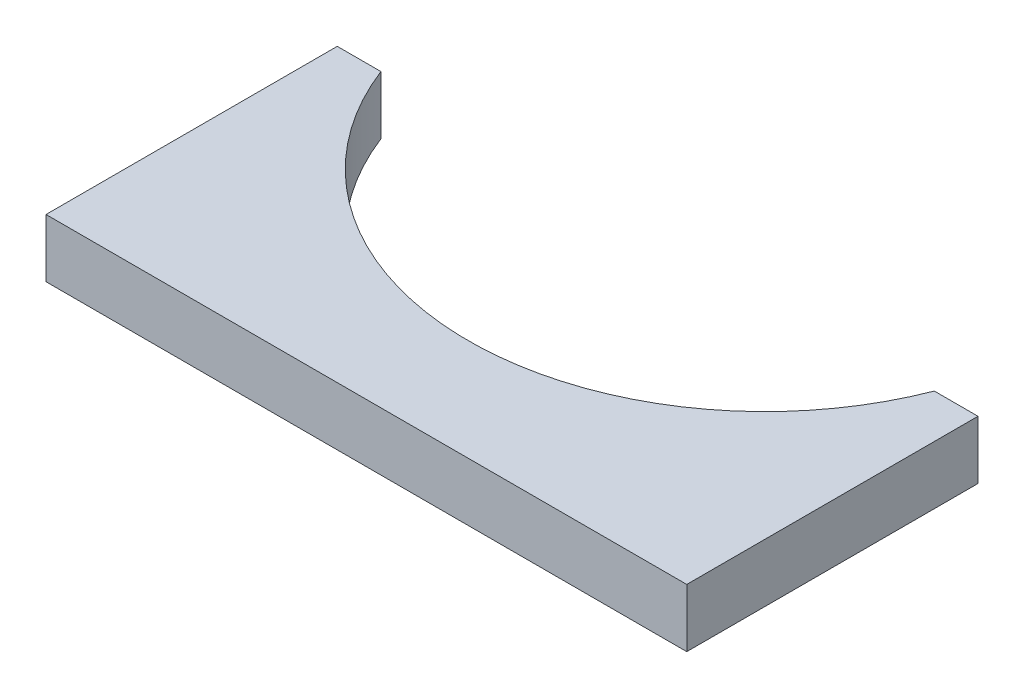
ISO-10303-21;
HEADER;
FILE_DESCRIPTION(('STEP AP214'),'2;1');
FILE_NAME('part.step','',(''),(''),'','','');
FILE_SCHEMA(('AUTOMOTIVE_DESIGN { 1 0 10303 214 1 1 1 1 }'));
ENDSEC;
DATA;
#1=APPLICATION_CONTEXT('core data for automotive mechanical design processes');
#2=APPLICATION_PROTOCOL_DEFINITION('international standard','automotive_design',2000,#1);
#3=PRODUCT_CONTEXT('',#1,'mechanical');
#4=PRODUCT('Part','Part','',(#3));
#5=PRODUCT_RELATED_PRODUCT_CATEGORY('part','',(#4));
#6=PRODUCT_DEFINITION_FORMATION('','',#4);
#7=PRODUCT_DEFINITION_CONTEXT('part definition',#1,'design');
#8=PRODUCT_DEFINITION('design','',#6,#7);
#9=PRODUCT_DEFINITION_SHAPE('','',#8);
#10=(LENGTH_UNIT() NAMED_UNIT(*) SI_UNIT(.MILLI.,.METRE.));
#11=(NAMED_UNIT(*) PLANE_ANGLE_UNIT() SI_UNIT($,.RADIAN.));
#12=(NAMED_UNIT(*) SI_UNIT($,.STERADIAN.) SOLID_ANGLE_UNIT());
#13=UNCERTAINTY_MEASURE_WITH_UNIT(LENGTH_MEASURE(1.E-05),#10,'distance_accuracy_value','');
#14=(GEOMETRIC_REPRESENTATION_CONTEXT(3) GLOBAL_UNCERTAINTY_ASSIGNED_CONTEXT((#13)) GLOBAL_UNIT_ASSIGNED_CONTEXT((#10,
#11,#12)) REPRESENTATION_CONTEXT('',''));
#15=CARTESIAN_POINT('',(0.,0.,0.));
#16=DIRECTION('',(0.,0.,1.));
#17=DIRECTION('',(1.,0.,0.));
#18=AXIS2_PLACEMENT_3D('',#15,#16,#17);
#19=CARTESIAN_POINT('',(13.97,2.54,-12.7));
#20=DIRECTION('',(0.,0.,1.));
#21=DIRECTION('',(1.,0.,0.));
#22=AXIS2_PLACEMENT_3D('',#19,#20,#21);
#23=PLANE('',#22);
#24=DIRECTION('',(-1.,0.,0.));
#25=VECTOR('',#24,1.);
#26=CARTESIAN_POINT('',(13.97,0.,-12.7));
#27=LINE('',#26,#25);
#28=CARTESIAN_POINT('',(13.97,0.,-12.7));
#29=VERTEX_POINT('',#28);
#30=CARTESIAN_POINT('',(12.065,0.,-12.7));
#31=VERTEX_POINT('',#30);
#32=EDGE_CURVE('E122',#29,#31,#27,.T.);
#33=ORIENTED_EDGE('',*,*,#32,.T.);
#34=DIRECTION('',(0.,-1.,0.));
#35=VECTOR('',#34,1.);
#36=CARTESIAN_POINT('',(12.065,2.54,-12.7));
#37=LINE('',#36,#35);
#38=CARTESIAN_POINT('',(12.065,2.54,-12.7));
#39=VERTEX_POINT('',#38);
#40=EDGE_CURVE('E11',#39,#31,#37,.T.);
#41=ORIENTED_EDGE('',*,*,#40,.F.);
#42=DIRECTION('',(-1.,0.,0.));
#43=VECTOR('',#42,1.);
#44=CARTESIAN_POINT('',(13.97,2.54,-12.7));
#45=LINE('',#44,#43);
#46=CARTESIAN_POINT('',(13.97,2.54,-12.7));
#47=VERTEX_POINT('',#46);
#48=EDGE_CURVE('E135',#47,#39,#45,.T.);
#49=ORIENTED_EDGE('',*,*,#48,.F.);
#50=DIRECTION('',(0.,-1.,0.));
#51=VECTOR('',#50,1.);
#52=CARTESIAN_POINT('',(13.97,2.54,-12.7));
#53=LINE('',#52,#51);
#54=EDGE_CURVE('E119',#47,#29,#53,.T.);
#55=ORIENTED_EDGE('',*,*,#54,.T.);
#56=EDGE_LOOP('',(#33,#41,#49,#55));
#57=FACE_BOUND('',#56,.T.);
#58=ADVANCED_FACE('F36',(#57),#23,.F.);
#59=CARTESIAN_POINT('',(0.,2.54,-17.3819770383757));
#60=DIRECTION('',(0.,-1.,0.));
#61=DIRECTION('',(0.,0.,-1.));
#62=AXIS2_PLACEMENT_3D('',#59,#60,#61);
#63=CYLINDRICAL_SURFACE('',#62,12.9416047686474);
#64=CARTESIAN_POINT('',(0.,0.,-17.3819770383757));
#65=DIRECTION('',(0.,-1.,0.));
#66=DIRECTION('',(0.,0.,1.));
#67=AXIS2_PLACEMENT_3D('',#64,#65,#66);
#68=CIRCLE('',#67,12.9416047686474);
#69=CARTESIAN_POINT('',(-12.065,0.,-12.7));
#70=VERTEX_POINT('',#69);
#71=EDGE_CURVE('E124',#31,#70,#68,.T.);
#72=ORIENTED_EDGE('',*,*,#71,.T.);
#73=DIRECTION('',(0.,-1.,0.));
#74=VECTOR('',#73,1.);
#75=CARTESIAN_POINT('',(-12.065,2.54,-12.7));
#76=LINE('',#75,#74);
#77=CARTESIAN_POINT('',(-12.065,2.54,-12.7));
#78=VERTEX_POINT('',#77);
#79=EDGE_CURVE('E46',#78,#70,#76,.T.);
#80=ORIENTED_EDGE('',*,*,#79,.F.);
#81=CARTESIAN_POINT('',(0.,2.54,-17.3819770383757));
#82=DIRECTION('',(0.,-1.,0.));
#83=DIRECTION('',(0.,0.,1.));
#84=AXIS2_PLACEMENT_3D('',#81,#82,#83);
#85=CIRCLE('',#84,12.9416047686474);
#86=EDGE_CURVE('E91',#39,#78,#85,.T.);
#87=ORIENTED_EDGE('',*,*,#86,.F.);
#88=ORIENTED_EDGE('',*,*,#40,.T.);
#89=EDGE_LOOP('',(#72,#80,#87,#88));
#90=FACE_BOUND('',#89,.T.);
#91=ADVANCED_FACE('F157',(#90),#63,.F.);
#92=CARTESIAN_POINT('',(-13.97,2.54,-12.7));
#93=DIRECTION('',(0.,0.,1.));
#94=DIRECTION('',(1.,0.,0.));
#95=AXIS2_PLACEMENT_3D('',#92,#93,#94);
#96=PLANE('',#95);
#97=DIRECTION('',(-1.,0.,0.));
#98=VECTOR('',#97,1.);
#99=CARTESIAN_POINT('',(-13.97,0.,-12.7));
#100=LINE('',#99,#98);
#101=CARTESIAN_POINT('',(-13.97,0.,-12.7));
#102=VERTEX_POINT('',#101);
#103=EDGE_CURVE('E130',#70,#102,#100,.T.);
#104=ORIENTED_EDGE('',*,*,#103,.T.);
#105=DIRECTION('',(0.,-1.,0.));
#106=VECTOR('',#105,1.);
#107=CARTESIAN_POINT('',(-13.97,2.54,-12.7));
#108=LINE('',#107,#106);
#109=CARTESIAN_POINT('',(-13.97,2.54,-12.7));
#110=VERTEX_POINT('',#109);
#111=EDGE_CURVE('E111',#110,#102,#108,.T.);
#112=ORIENTED_EDGE('',*,*,#111,.F.);
#113=DIRECTION('',(-1.,0.,0.));
#114=VECTOR('',#113,1.);
#115=CARTESIAN_POINT('',(-13.97,2.54,-12.7));
#116=LINE('',#115,#114);
#117=EDGE_CURVE('E101',#78,#110,#116,.T.);
#118=ORIENTED_EDGE('',*,*,#117,.F.);
#119=ORIENTED_EDGE('',*,*,#79,.T.);
#120=EDGE_LOOP('',(#104,#112,#118,#119));
#121=FACE_BOUND('',#120,.T.);
#122=ADVANCED_FACE('F138',(#121),#96,.F.);
#123=CARTESIAN_POINT('',(-13.97,2.54,0.));
#124=DIRECTION('',(1.,0.,0.));
#125=DIRECTION('',(0.,0.,-1.));
#126=AXIS2_PLACEMENT_3D('',#123,#124,#125);
#127=PLANE('',#126);
#128=DIRECTION('',(0.,0.,1.));
#129=VECTOR('',#128,1.);
#130=CARTESIAN_POINT('',(-13.97,0.,0.));
#131=LINE('',#130,#129);
#132=CARTESIAN_POINT('',(-13.97,0.,0.));
#133=VERTEX_POINT('',#132);
#134=EDGE_CURVE('E115',#102,#133,#131,.T.);
#135=ORIENTED_EDGE('',*,*,#134,.T.);
#136=DIRECTION('',(0.,-1.,0.));
#137=VECTOR('',#136,1.);
#138=CARTESIAN_POINT('',(-13.97,2.54,0.));
#139=LINE('',#138,#137);
#140=CARTESIAN_POINT('',(-13.97,2.54,0.));
#141=VERTEX_POINT('',#140);
#142=EDGE_CURVE('E108',#141,#133,#139,.T.);
#143=ORIENTED_EDGE('',*,*,#142,.F.);
#144=DIRECTION('',(0.,0.,1.));
#145=VECTOR('',#144,1.);
#146=CARTESIAN_POINT('',(-13.97,2.54,0.));
#147=LINE('',#146,#145);
#148=EDGE_CURVE('E97',#110,#141,#147,.T.);
#149=ORIENTED_EDGE('',*,*,#148,.F.);
#150=ORIENTED_EDGE('',*,*,#111,.T.);
#151=EDGE_LOOP('',(#135,#143,#149,#150));
#152=FACE_BOUND('',#151,.T.);
#153=ADVANCED_FACE('F110',(#152),#127,.F.);
#154=CARTESIAN_POINT('',(13.97,2.54,0.));
#155=DIRECTION('',(0.,0.,-1.));
#156=DIRECTION('',(-1.,0.,0.));
#157=AXIS2_PLACEMENT_3D('',#154,#155,#156);
#158=PLANE('',#157);
#159=DIRECTION('',(1.,0.,0.));
#160=VECTOR('',#159,1.);
#161=CARTESIAN_POINT('',(13.97,0.,0.));
#162=LINE('',#161,#160);
#163=CARTESIAN_POINT('',(13.97,0.,0.));
#164=VERTEX_POINT('',#163);
#165=EDGE_CURVE('E77',#133,#164,#162,.T.);
#166=ORIENTED_EDGE('',*,*,#165,.T.);
#167=DIRECTION('',(0.,-1.,0.));
#168=VECTOR('',#167,1.);
#169=CARTESIAN_POINT('',(13.97,2.54,0.));
#170=LINE('',#169,#168);
#171=CARTESIAN_POINT('',(13.97,2.54,0.));
#172=VERTEX_POINT('',#171);
#173=EDGE_CURVE('E114',#172,#164,#170,.T.);
#174=ORIENTED_EDGE('',*,*,#173,.F.);
#175=DIRECTION('',(1.,0.,0.));
#176=VECTOR('',#175,1.);
#177=CARTESIAN_POINT('',(13.97,2.54,0.));
#178=LINE('',#177,#176);
#179=EDGE_CURVE('E105',#141,#172,#178,.T.);
#180=ORIENTED_EDGE('',*,*,#179,.F.);
#181=ORIENTED_EDGE('',*,*,#142,.T.);
#182=EDGE_LOOP('',(#166,#174,#180,#181));
#183=FACE_BOUND('',#182,.T.);
#184=ADVANCED_FACE('F116',(#183),#158,.F.);
#185=CARTESIAN_POINT('',(13.97,2.54,0.));
#186=DIRECTION('',(-1.,0.,0.));
#187=DIRECTION('',(0.,0.,1.));
#188=AXIS2_PLACEMENT_3D('',#185,#186,#187);
#189=PLANE('',#188);
#190=DIRECTION('',(0.,0.,-1.));
#191=VECTOR('',#190,1.);
#192=CARTESIAN_POINT('',(13.97,0.,0.));
#193=LINE('',#192,#191);
#194=EDGE_CURVE('E81',#164,#29,#193,.T.);
#195=ORIENTED_EDGE('',*,*,#194,.T.);
#196=ORIENTED_EDGE('',*,*,#54,.F.);
#197=DIRECTION('',(0.,0.,-1.));
#198=VECTOR('',#197,1.);
#199=CARTESIAN_POINT('',(13.97,2.54,0.));
#200=LINE('',#199,#198);
#201=EDGE_CURVE('E53',#172,#47,#200,.T.);
#202=ORIENTED_EDGE('',*,*,#201,.F.);
#203=ORIENTED_EDGE('',*,*,#173,.T.);
#204=EDGE_LOOP('',(#195,#196,#202,#203));
#205=FACE_BOUND('',#204,.T.);
#206=ADVANCED_FACE('F144',(#205),#189,.F.);
#207=CARTESIAN_POINT('',(0.,2.54,-17.3819770383757));
#208=DIRECTION('',(0.,1.,0.));
#209=DIRECTION('',(0.,0.,1.));
#210=AXIS2_PLACEMENT_3D('',#207,#208,#209);
#211=PLANE('',#210);
#212=ORIENTED_EDGE('',*,*,#48,.T.);
#213=ORIENTED_EDGE('',*,*,#86,.T.);
#214=ORIENTED_EDGE('',*,*,#117,.T.);
#215=ORIENTED_EDGE('',*,*,#148,.T.);
#216=ORIENTED_EDGE('',*,*,#179,.T.);
#217=ORIENTED_EDGE('',*,*,#201,.T.);
#218=EDGE_LOOP('',(#212,#213,#214,#215,#216,#217));
#219=FACE_BOUND('',#218,.T.);
#220=ADVANCED_FACE('F99',(#219),#211,.T.);
#221=CARTESIAN_POINT('',(0.,0.,-17.3819770383757));
#222=DIRECTION('',(0.,1.,0.));
#223=DIRECTION('',(0.,0.,1.));
#224=AXIS2_PLACEMENT_3D('',#221,#222,#223);
#225=PLANE('',#224);
#226=ORIENTED_EDGE('',*,*,#32,.F.);
#227=ORIENTED_EDGE('',*,*,#194,.F.);
#228=ORIENTED_EDGE('',*,*,#165,.F.);
#229=ORIENTED_EDGE('',*,*,#134,.F.);
#230=ORIENTED_EDGE('',*,*,#103,.F.);
#231=ORIENTED_EDGE('',*,*,#71,.F.);
#232=EDGE_LOOP('',(#226,#227,#228,#229,#230,#231));
#233=FACE_BOUND('',#232,.T.);
#234=ADVANCED_FACE('F141',(#233),#225,.F.);
#235=CLOSED_SHELL('',(#58,#91,#122,#153,#184,#206,#220,#234));
#236=MANIFOLD_SOLID_BREP('B2',#235);
#237=ADVANCED_BREP_SHAPE_REPRESENTATION('',(#18,#236),#14);
#238=SHAPE_DEFINITION_REPRESENTATION(#9,#237);
ENDSEC;
END-ISO-10303-21;
